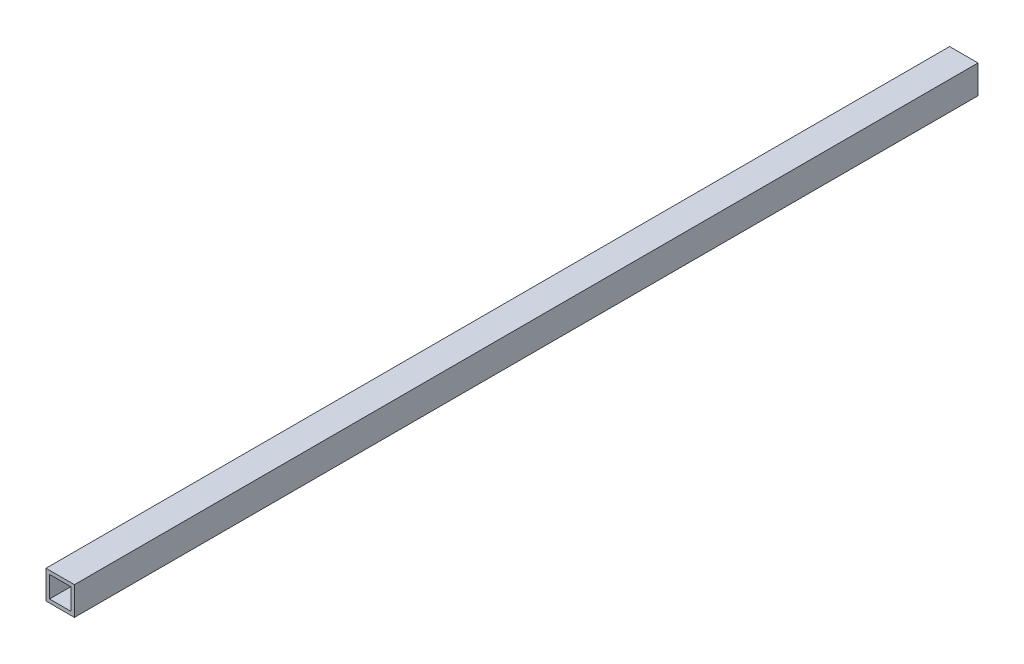
ISO-10303-21;
HEADER;
FILE_DESCRIPTION(('STEP AP214'),'2;1');
FILE_NAME('part.step','',(''),(''),'','','');
FILE_SCHEMA(('AUTOMOTIVE_DESIGN { 1 0 10303 214 1 1 1 1 }'));
ENDSEC;
DATA;
#1=APPLICATION_CONTEXT('core data for automotive mechanical design processes');
#2=APPLICATION_PROTOCOL_DEFINITION('international standard','automotive_design',2000,#1);
#3=PRODUCT_CONTEXT('',#1,'mechanical');
#4=PRODUCT('Part','Part','',(#3));
#5=PRODUCT_RELATED_PRODUCT_CATEGORY('part','',(#4));
#6=PRODUCT_DEFINITION_FORMATION('','',#4);
#7=PRODUCT_DEFINITION_CONTEXT('part definition',#1,'design');
#8=PRODUCT_DEFINITION('design','',#6,#7);
#9=PRODUCT_DEFINITION_SHAPE('','',#8);
#10=(LENGTH_UNIT() NAMED_UNIT(*) SI_UNIT(.MILLI.,.METRE.));
#11=(NAMED_UNIT(*) PLANE_ANGLE_UNIT() SI_UNIT($,.RADIAN.));
#12=(NAMED_UNIT(*) SI_UNIT($,.STERADIAN.) SOLID_ANGLE_UNIT());
#13=UNCERTAINTY_MEASURE_WITH_UNIT(LENGTH_MEASURE(1.E-05),#10,'distance_accuracy_value','');
#14=(GEOMETRIC_REPRESENTATION_CONTEXT(3) GLOBAL_UNCERTAINTY_ASSIGNED_CONTEXT((#13)) GLOBAL_UNIT_ASSIGNED_CONTEXT((#10,
#11,#12)) REPRESENTATION_CONTEXT('',''));
#15=CARTESIAN_POINT('',(0.,0.,0.));
#16=DIRECTION('',(0.,0.,1.));
#17=DIRECTION('',(1.,0.,0.));
#18=AXIS2_PLACEMENT_3D('',#15,#16,#17);
#19=CARTESIAN_POINT('',(0.,0.,403.86));
#20=DIRECTION('',(0.,0.,1.));
#21=DIRECTION('',(1.,0.,0.));
#22=AXIS2_PLACEMENT_3D('',#19,#20,#21);
#23=PLANE('',#22);
#24=DIRECTION('',(0.,-1.,0.));
#25=VECTOR('',#24,1.);
#26=CARTESIAN_POINT('',(-12.7,-12.7,403.86));
#27=LINE('',#26,#25);
#28=CARTESIAN_POINT('',(-12.7,12.7,403.86));
#29=VERTEX_POINT('',#28);
#30=CARTESIAN_POINT('',(-12.7,-12.7,403.86));
#31=VERTEX_POINT('',#30);
#32=EDGE_CURVE('E117',#29,#31,#27,.T.);
#33=ORIENTED_EDGE('',*,*,#32,.T.);
#34=DIRECTION('',(1.,0.,0.));
#35=VECTOR('',#34,1.);
#36=CARTESIAN_POINT('',(12.7,-12.7,403.86));
#37=LINE('',#36,#35);
#38=CARTESIAN_POINT('',(12.7,-12.7,403.86));
#39=VERTEX_POINT('',#38);
#40=EDGE_CURVE('E176',#31,#39,#37,.T.);
#41=ORIENTED_EDGE('',*,*,#40,.T.);
#42=DIRECTION('',(0.,1.,0.));
#43=VECTOR('',#42,1.);
#44=CARTESIAN_POINT('',(12.7,-12.7,403.86));
#45=LINE('',#44,#43);
#46=CARTESIAN_POINT('',(12.7,12.7,403.86));
#47=VERTEX_POINT('',#46);
#48=EDGE_CURVE('E179',#39,#47,#45,.T.);
#49=ORIENTED_EDGE('',*,*,#48,.T.);
#50=DIRECTION('',(-1.,0.,0.));
#51=VECTOR('',#50,1.);
#52=CARTESIAN_POINT('',(12.7,12.7,403.86));
#53=LINE('',#52,#51);
#54=EDGE_CURVE('E63',#47,#29,#53,.T.);
#55=ORIENTED_EDGE('',*,*,#54,.T.);
#56=EDGE_LOOP('',(#33,#41,#49,#55));
#57=FACE_BOUND('',#56,.T.);
#58=DIRECTION('',(1.,0.,0.));
#59=VECTOR('',#58,1.);
#60=CARTESIAN_POINT('',(9.525,-9.525,403.86));
#61=LINE('',#60,#59);
#62=CARTESIAN_POINT('',(-9.52499999999999,-9.525,403.86));
#63=VERTEX_POINT('',#62);
#64=CARTESIAN_POINT('',(9.525,-9.525,403.86));
#65=VERTEX_POINT('',#64);
#66=EDGE_CURVE('E158',#63,#65,#61,.T.);
#67=ORIENTED_EDGE('',*,*,#66,.F.);
#68=DIRECTION('',(0.,-1.,0.));
#69=VECTOR('',#68,1.);
#70=CARTESIAN_POINT('',(-9.52499999999999,-9.525,403.86));
#71=LINE('',#70,#69);
#72=CARTESIAN_POINT('',(-9.52499999999999,9.525,403.86));
#73=VERTEX_POINT('',#72);
#74=EDGE_CURVE('E113',#73,#63,#71,.T.);
#75=ORIENTED_EDGE('',*,*,#74,.F.);
#76=DIRECTION('',(-1.,0.,0.));
#77=VECTOR('',#76,1.);
#78=CARTESIAN_POINT('',(9.525,9.525,403.86));
#79=LINE('',#78,#77);
#80=CARTESIAN_POINT('',(9.525,9.525,403.86));
#81=VERTEX_POINT('',#80);
#82=EDGE_CURVE('E164',#81,#73,#79,.T.);
#83=ORIENTED_EDGE('',*,*,#82,.F.);
#84=DIRECTION('',(0.,1.,0.));
#85=VECTOR('',#84,1.);
#86=CARTESIAN_POINT('',(9.525,-9.525,403.86));
#87=LINE('',#86,#85);
#88=EDGE_CURVE('E161',#65,#81,#87,.T.);
#89=ORIENTED_EDGE('',*,*,#88,.F.);
#90=EDGE_LOOP('',(#67,#75,#83,#89));
#91=FACE_BOUND('',#90,.T.);
#92=ADVANCED_FACE('F39',(#57,#91),#23,.T.);
#93=CARTESIAN_POINT('',(-12.7,-12.7,403.86));
#94=DIRECTION('',(1.,0.,0.));
#95=DIRECTION('',(0.,0.,-1.));
#96=AXIS2_PLACEMENT_3D('',#93,#94,#95);
#97=PLANE('',#96);
#98=DIRECTION('',(0.,0.,-1.));
#99=VECTOR('',#98,1.);
#100=CARTESIAN_POINT('',(-12.7,12.7,403.86));
#101=LINE('',#100,#99);
#102=CARTESIAN_POINT('',(-12.7,12.7,-403.86));
#103=VERTEX_POINT('',#102);
#104=EDGE_CURVE('E184',#29,#103,#101,.T.);
#105=ORIENTED_EDGE('',*,*,#104,.T.);
#106=DIRECTION('',(0.,-1.,0.));
#107=VECTOR('',#106,1.);
#108=CARTESIAN_POINT('',(-12.7,-12.7,-403.86));
#109=LINE('',#108,#107);
#110=CARTESIAN_POINT('',(-12.7,-12.7,-403.86));
#111=VERTEX_POINT('',#110);
#112=EDGE_CURVE('E140',#103,#111,#109,.T.);
#113=ORIENTED_EDGE('',*,*,#112,.T.);
#114=DIRECTION('',(0.,0.,-1.));
#115=VECTOR('',#114,1.);
#116=CARTESIAN_POINT('',(-12.7,-12.7,403.86));
#117=LINE('',#116,#115);
#118=EDGE_CURVE('E11',#31,#111,#117,.T.);
#119=ORIENTED_EDGE('',*,*,#118,.F.);
#120=ORIENTED_EDGE('',*,*,#32,.F.);
#121=EDGE_LOOP('',(#105,#113,#119,#120));
#122=FACE_BOUND('',#121,.T.);
#123=ADVANCED_FACE('F41',(#122),#97,.F.);
#124=CARTESIAN_POINT('',(12.7,-12.7,403.86));
#125=DIRECTION('',(0.,1.,0.));
#126=DIRECTION('',(0.,0.,1.));
#127=AXIS2_PLACEMENT_3D('',#124,#125,#126);
#128=PLANE('',#127);
#129=ORIENTED_EDGE('',*,*,#118,.T.);
#130=DIRECTION('',(1.,0.,0.));
#131=VECTOR('',#130,1.);
#132=CARTESIAN_POINT('',(12.7,-12.7,-403.86));
#133=LINE('',#132,#131);
#134=CARTESIAN_POINT('',(12.7,-12.7,-403.86));
#135=VERTEX_POINT('',#134);
#136=EDGE_CURVE('E144',#111,#135,#133,.T.);
#137=ORIENTED_EDGE('',*,*,#136,.T.);
#138=DIRECTION('',(0.,0.,-1.));
#139=VECTOR('',#138,1.);
#140=CARTESIAN_POINT('',(12.7,-12.7,403.86));
#141=LINE('',#140,#139);
#142=EDGE_CURVE('E48',#39,#135,#141,.T.);
#143=ORIENTED_EDGE('',*,*,#142,.F.);
#144=ORIENTED_EDGE('',*,*,#40,.F.);
#145=EDGE_LOOP('',(#129,#137,#143,#144));
#146=FACE_BOUND('',#145,.T.);
#147=ADVANCED_FACE('F200',(#146),#128,.F.);
#148=CARTESIAN_POINT('',(12.7,-12.7,403.86));
#149=DIRECTION('',(-1.,0.,0.));
#150=DIRECTION('',(0.,0.,1.));
#151=AXIS2_PLACEMENT_3D('',#148,#149,#150);
#152=PLANE('',#151);
#153=ORIENTED_EDGE('',*,*,#142,.T.);
#154=DIRECTION('',(0.,1.,0.));
#155=VECTOR('',#154,1.);
#156=CARTESIAN_POINT('',(12.7,-12.7,-403.86));
#157=LINE('',#156,#155);
#158=CARTESIAN_POINT('',(12.7,12.7,-403.86));
#159=VERTEX_POINT('',#158);
#160=EDGE_CURVE('E148',#135,#159,#157,.T.);
#161=ORIENTED_EDGE('',*,*,#160,.T.);
#162=DIRECTION('',(0.,0.,-1.));
#163=VECTOR('',#162,1.);
#164=CARTESIAN_POINT('',(12.7,12.7,403.86));
#165=LINE('',#164,#163);
#166=EDGE_CURVE('E187',#47,#159,#165,.T.);
#167=ORIENTED_EDGE('',*,*,#166,.F.);
#168=ORIENTED_EDGE('',*,*,#48,.F.);
#169=EDGE_LOOP('',(#153,#161,#167,#168));
#170=FACE_BOUND('',#169,.T.);
#171=ADVANCED_FACE('F194',(#170),#152,.F.);
#172=CARTESIAN_POINT('',(12.7,12.7,403.86));
#173=DIRECTION('',(0.,-1.,0.));
#174=DIRECTION('',(0.,0.,-1.));
#175=AXIS2_PLACEMENT_3D('',#172,#173,#174);
#176=PLANE('',#175);
#177=ORIENTED_EDGE('',*,*,#166,.T.);
#178=DIRECTION('',(-1.,0.,0.));
#179=VECTOR('',#178,1.);
#180=CARTESIAN_POINT('',(12.7,12.7,-403.86));
#181=LINE('',#180,#179);
#182=EDGE_CURVE('E152',#159,#103,#181,.T.);
#183=ORIENTED_EDGE('',*,*,#182,.T.);
#184=ORIENTED_EDGE('',*,*,#104,.F.);
#185=ORIENTED_EDGE('',*,*,#54,.F.);
#186=EDGE_LOOP('',(#177,#183,#184,#185));
#187=FACE_BOUND('',#186,.T.);
#188=ADVANCED_FACE('F205',(#187),#176,.F.);
#189=CARTESIAN_POINT('',(-9.52499999999999,-9.525,403.86));
#190=DIRECTION('',(1.,0.,0.));
#191=DIRECTION('',(0.,0.,-1.));
#192=AXIS2_PLACEMENT_3D('',#189,#190,#191);
#193=PLANE('',#192);
#194=DIRECTION('',(0.,0.,-1.));
#195=VECTOR('',#194,1.);
#196=CARTESIAN_POINT('',(-9.52499999999999,-9.525,403.86));
#197=LINE('',#196,#195);
#198=CARTESIAN_POINT('',(-9.52499999999999,-9.525,-403.86));
#199=VERTEX_POINT('',#198);
#200=EDGE_CURVE('E105',#63,#199,#197,.T.);
#201=ORIENTED_EDGE('',*,*,#200,.T.);
#202=DIRECTION('',(0.,-1.,0.));
#203=VECTOR('',#202,1.);
#204=CARTESIAN_POINT('',(-9.52499999999999,-9.525,-403.86));
#205=LINE('',#204,#203);
#206=CARTESIAN_POINT('',(-9.52499999999999,9.525,-403.86));
#207=VERTEX_POINT('',#206);
#208=EDGE_CURVE('E110',#207,#199,#205,.T.);
#209=ORIENTED_EDGE('',*,*,#208,.F.);
#210=DIRECTION('',(0.,0.,-1.));
#211=VECTOR('',#210,1.);
#212=CARTESIAN_POINT('',(-9.52499999999999,9.525,403.86));
#213=LINE('',#212,#211);
#214=EDGE_CURVE('E167',#73,#207,#213,.T.);
#215=ORIENTED_EDGE('',*,*,#214,.F.);
#216=ORIENTED_EDGE('',*,*,#74,.T.);
#217=EDGE_LOOP('',(#201,#209,#215,#216));
#218=FACE_BOUND('',#217,.T.);
#219=ADVANCED_FACE('F107',(#218),#193,.T.);
#220=CARTESIAN_POINT('',(9.525,-9.525,403.86));
#221=DIRECTION('',(0.,1.,0.));
#222=DIRECTION('',(0.,0.,1.));
#223=AXIS2_PLACEMENT_3D('',#220,#221,#222);
#224=PLANE('',#223);
#225=DIRECTION('',(0.,0.,-1.));
#226=VECTOR('',#225,1.);
#227=CARTESIAN_POINT('',(9.525,-9.525,403.86));
#228=LINE('',#227,#226);
#229=CARTESIAN_POINT('',(9.525,-9.525,-403.86));
#230=VERTEX_POINT('',#229);
#231=EDGE_CURVE('E118',#65,#230,#228,.T.);
#232=ORIENTED_EDGE('',*,*,#231,.T.);
#233=DIRECTION('',(1.,0.,0.));
#234=VECTOR('',#233,1.);
#235=CARTESIAN_POINT('',(9.525,-9.525,-403.86));
#236=LINE('',#235,#234);
#237=EDGE_CURVE('E121',#199,#230,#236,.T.);
#238=ORIENTED_EDGE('',*,*,#237,.F.);
#239=ORIENTED_EDGE('',*,*,#200,.F.);
#240=ORIENTED_EDGE('',*,*,#66,.T.);
#241=EDGE_LOOP('',(#232,#238,#239,#240));
#242=FACE_BOUND('',#241,.T.);
#243=ADVANCED_FACE('F122',(#242),#224,.T.);
#244=CARTESIAN_POINT('',(9.525,-9.525,403.86));
#245=DIRECTION('',(-1.,0.,0.));
#246=DIRECTION('',(0.,0.,1.));
#247=AXIS2_PLACEMENT_3D('',#244,#245,#246);
#248=PLANE('',#247);
#249=DIRECTION('',(0.,0.,-1.));
#250=VECTOR('',#249,1.);
#251=CARTESIAN_POINT('',(9.525,9.525,403.86));
#252=LINE('',#251,#250);
#253=CARTESIAN_POINT('',(9.525,9.525,-403.86));
#254=VERTEX_POINT('',#253);
#255=EDGE_CURVE('E55',#81,#254,#252,.T.);
#256=ORIENTED_EDGE('',*,*,#255,.T.);
#257=DIRECTION('',(0.,1.,0.));
#258=VECTOR('',#257,1.);
#259=CARTESIAN_POINT('',(9.525,-9.525,-403.86));
#260=LINE('',#259,#258);
#261=EDGE_CURVE('E128',#230,#254,#260,.T.);
#262=ORIENTED_EDGE('',*,*,#261,.F.);
#263=ORIENTED_EDGE('',*,*,#231,.F.);
#264=ORIENTED_EDGE('',*,*,#88,.T.);
#265=EDGE_LOOP('',(#256,#262,#263,#264));
#266=FACE_BOUND('',#265,.T.);
#267=ADVANCED_FACE('F223',(#266),#248,.T.);
#268=CARTESIAN_POINT('',(9.525,9.525,403.86));
#269=DIRECTION('',(0.,-1.,0.));
#270=DIRECTION('',(0.,0.,-1.));
#271=AXIS2_PLACEMENT_3D('',#268,#269,#270);
#272=PLANE('',#271);
#273=ORIENTED_EDGE('',*,*,#214,.T.);
#274=DIRECTION('',(-1.,0.,0.));
#275=VECTOR('',#274,1.);
#276=CARTESIAN_POINT('',(9.525,9.525,-403.86));
#277=LINE('',#276,#275);
#278=EDGE_CURVE('E132',#254,#207,#277,.T.);
#279=ORIENTED_EDGE('',*,*,#278,.F.);
#280=ORIENTED_EDGE('',*,*,#255,.F.);
#281=ORIENTED_EDGE('',*,*,#82,.T.);
#282=EDGE_LOOP('',(#273,#279,#280,#281));
#283=FACE_BOUND('',#282,.T.);
#284=ADVANCED_FACE('F226',(#283),#272,.T.);
#285=CARTESIAN_POINT('',(0.,0.,-403.86));
#286=DIRECTION('',(0.,0.,1.));
#287=DIRECTION('',(1.,0.,0.));
#288=AXIS2_PLACEMENT_3D('',#285,#286,#287);
#289=PLANE('',#288);
#290=ORIENTED_EDGE('',*,*,#278,.T.);
#291=ORIENTED_EDGE('',*,*,#208,.T.);
#292=ORIENTED_EDGE('',*,*,#237,.T.);
#293=ORIENTED_EDGE('',*,*,#261,.T.);
#294=EDGE_LOOP('',(#290,#291,#292,#293));
#295=FACE_BOUND('',#294,.T.);
#296=ORIENTED_EDGE('',*,*,#112,.F.);
#297=ORIENTED_EDGE('',*,*,#182,.F.);
#298=ORIENTED_EDGE('',*,*,#160,.F.);
#299=ORIENTED_EDGE('',*,*,#136,.F.);
#300=EDGE_LOOP('',(#296,#297,#298,#299));
#301=FACE_BOUND('',#300,.T.);
#302=ADVANCED_FACE('F130',(#295,#301),#289,.F.);
#303=CLOSED_SHELL('',(#92,#123,#147,#171,#188,#219,#243,#267,#284,#302));
#304=MANIFOLD_SOLID_BREP('B2',#303);
#305=ADVANCED_BREP_SHAPE_REPRESENTATION('',(#18,#304),#14);
#306=SHAPE_DEFINITION_REPRESENTATION(#9,#305);
ENDSEC;
END-ISO-10303-21;
